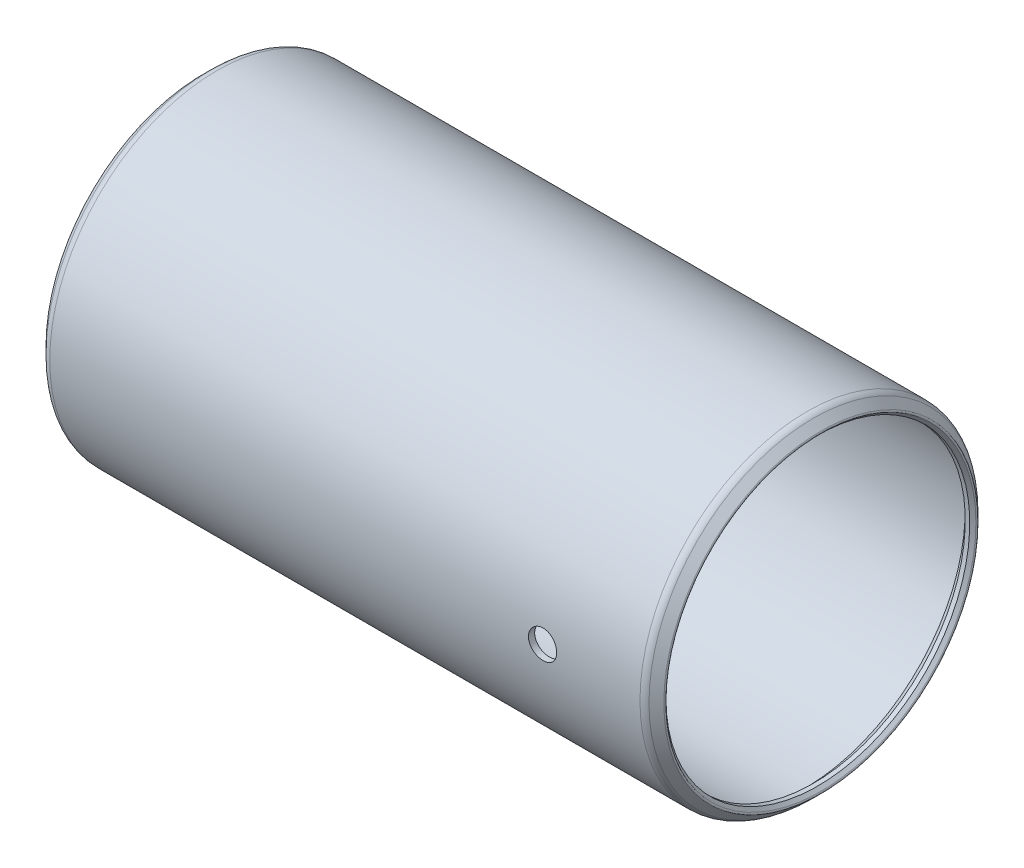
ISO-10303-21;
HEADER;
FILE_DESCRIPTION(('STEP AP214'),'2;1');
FILE_NAME('part.step','',(''),(''),'','','');
FILE_SCHEMA(('AUTOMOTIVE_DESIGN { 1 0 10303 214 1 1 1 1 }'));
ENDSEC;
DATA;
#1=APPLICATION_CONTEXT('core data for automotive mechanical design processes');
#2=APPLICATION_PROTOCOL_DEFINITION('international standard','automotive_design',2000,#1);
#3=PRODUCT_CONTEXT('',#1,'mechanical');
#4=PRODUCT('Part','Part','',(#3));
#5=PRODUCT_RELATED_PRODUCT_CATEGORY('part','',(#4));
#6=PRODUCT_DEFINITION_FORMATION('','',#4);
#7=PRODUCT_DEFINITION_CONTEXT('part definition',#1,'design');
#8=PRODUCT_DEFINITION('design','',#6,#7);
#9=PRODUCT_DEFINITION_SHAPE('','',#8);
#10=(LENGTH_UNIT() NAMED_UNIT(*) SI_UNIT(.MILLI.,.METRE.));
#11=(NAMED_UNIT(*) PLANE_ANGLE_UNIT() SI_UNIT($,.RADIAN.));
#12=(NAMED_UNIT(*) SI_UNIT($,.STERADIAN.) SOLID_ANGLE_UNIT());
#13=UNCERTAINTY_MEASURE_WITH_UNIT(LENGTH_MEASURE(1.E-05),#10,'distance_accuracy_value','');
#14=(GEOMETRIC_REPRESENTATION_CONTEXT(3) GLOBAL_UNCERTAINTY_ASSIGNED_CONTEXT((#13)) GLOBAL_UNIT_ASSIGNED_CONTEXT((#10,
#11,#12)) REPRESENTATION_CONTEXT('',''));
#15=CARTESIAN_POINT('',(0.,0.,0.));
#16=DIRECTION('',(0.,0.,1.));
#17=DIRECTION('',(1.,0.,0.));
#18=AXIS2_PLACEMENT_3D('',#15,#16,#17);
#19=CARTESIAN_POINT('',(-0.639512806053463,0.,0.));
#20=DIRECTION('',(-1.,0.,0.));
#21=DIRECTION('',(0.,0.,1.));
#22=AXIS2_PLACEMENT_3D('',#19,#20,#21);
#23=CONICAL_SURFACE('',#22,13.1045628060535,0.785398163397435);
#24=CARTESIAN_POINT('',(-0.639512806053469,0.,0.));
#25=DIRECTION('',(1.,0.,0.));
#26=DIRECTION('',(0.,0.,-1.));
#27=AXIS2_PLACEMENT_3D('',#24,#25,#26);
#28=CIRCLE('',#27,13.1045628060535);
#29=CARTESIAN_POINT('',(-0.639512806053469,0.,-13.1045628060535));
#30=VERTEX_POINT('',#29);
#31=EDGE_CURVE('E136',#30,#30,#28,.T.);
#32=ORIENTED_EDGE('',*,*,#31,.F.);
#33=EDGE_LOOP('',(#32));
#34=FACE_BOUND('',#33,.T.);
#35=CARTESIAN_POINT('',(-0.380999999999999,0.,0.));
#36=DIRECTION('',(-1.,0.,0.));
#37=DIRECTION('',(0.,0.,1.));
#38=AXIS2_PLACEMENT_3D('',#35,#36,#37);
#39=CIRCLE('',#38,12.84605);
#40=CARTESIAN_POINT('',(-0.380999999999999,0.,12.84605));
#41=VERTEX_POINT('',#40);
#42=EDGE_CURVE('E139',#41,#41,#39,.F.);
#43=ORIENTED_EDGE('',*,*,#42,.T.);
#44=EDGE_LOOP('',(#43));
#45=FACE_BOUND('',#44,.T.);
#46=ADVANCED_FACE('F15',(#34,#45),#23,.F.);
#47=CARTESIAN_POINT('',(51.6046128060534,0.,0.));
#48=DIRECTION('',(1.,0.,0.));
#49=DIRECTION('',(0.,1.,0.));
#50=AXIS2_PLACEMENT_3D('',#47,#48,#49);
#51=CONICAL_SURFACE('',#50,13.1045628060534,0.785398163397472);
#52=CARTESIAN_POINT('',(51.3461,0.,0.));
#53=DIRECTION('',(-1.,0.,0.));
#54=DIRECTION('',(0.,0.,1.));
#55=AXIS2_PLACEMENT_3D('',#52,#53,#54);
#56=CIRCLE('',#55,12.84605);
#57=CARTESIAN_POINT('',(51.3461,0.,12.84605));
#58=VERTEX_POINT('',#57);
#59=EDGE_CURVE('E144',#58,#58,#56,.T.);
#60=ORIENTED_EDGE('',*,*,#59,.T.);
#61=EDGE_LOOP('',(#60));
#62=FACE_BOUND('',#61,.T.);
#63=CARTESIAN_POINT('',(51.6046128060534,0.,0.));
#64=DIRECTION('',(1.,0.,0.));
#65=DIRECTION('',(0.,0.,-1.));
#66=AXIS2_PLACEMENT_3D('',#63,#64,#65);
#67=CIRCLE('',#66,13.1045628060534);
#68=CARTESIAN_POINT('',(51.6046128060534,0.,-13.1045628060534));
#69=VERTEX_POINT('',#68);
#70=EDGE_CURVE('E112',#69,#69,#67,.F.);
#71=ORIENTED_EDGE('',*,*,#70,.F.);
#72=EDGE_LOOP('',(#71));
#73=FACE_BOUND('',#72,.T.);
#74=ADVANCED_FACE('F149',(#62,#73),#51,.F.);
#75=CARTESIAN_POINT('',(50.9651,0.,0.));
#76=DIRECTION('',(-1.,0.,0.));
#77=DIRECTION('',(0.,0.,1.));
#78=AXIS2_PLACEMENT_3D('',#75,#76,#77);
#79=CYLINDRICAL_SURFACE('',#78,12.84605);
#80=CARTESIAN_POINT('',(50.9651,0.,0.));
#81=DIRECTION('',(-1.,0.,0.));
#82=DIRECTION('',(0.,0.,1.));
#83=AXIS2_PLACEMENT_3D('',#80,#81,#82);
#84=CIRCLE('',#83,12.84605);
#85=CARTESIAN_POINT('',(50.9651,0.,12.84605));
#86=VERTEX_POINT('',#85);
#87=EDGE_CURVE('E107',#86,#86,#84,.T.);
#88=ORIENTED_EDGE('',*,*,#87,.T.);
#89=EDGE_LOOP('',(#88));
#90=FACE_BOUND('',#89,.T.);
#91=ORIENTED_EDGE('',*,*,#59,.F.);
#92=EDGE_LOOP('',(#91));
#93=FACE_BOUND('',#92,.T.);
#94=ADVANCED_FACE('F152',(#90,#93),#79,.F.);
#95=CARTESIAN_POINT('',(50.9651,0.,0.));
#96=DIRECTION('',(-1.,0.,0.));
#97=DIRECTION('',(0.,0.,1.));
#98=AXIS2_PLACEMENT_3D('',#95,#96,#97);
#99=CYLINDRICAL_SURFACE('',#98,12.84605);
#100=ORIENTED_EDGE('',*,*,#42,.F.);
#101=EDGE_LOOP('',(#100));
#102=FACE_BOUND('',#101,.T.);
#103=CARTESIAN_POINT('',(0.,0.,0.));
#104=DIRECTION('',(1.,0.,0.));
#105=DIRECTION('',(0.,0.,-1.));
#106=AXIS2_PLACEMENT_3D('',#103,#104,#105);
#107=CIRCLE('',#106,12.84605);
#108=CARTESIAN_POINT('',(0.,0.,-12.84605));
#109=VERTEX_POINT('',#108);
#110=EDGE_CURVE('E102',#109,#109,#107,.T.);
#111=ORIENTED_EDGE('',*,*,#110,.T.);
#112=EDGE_LOOP('',(#111));
#113=FACE_BOUND('',#112,.T.);
#114=ADVANCED_FACE('F130',(#102,#113),#99,.F.);
#115=CARTESIAN_POINT('',(-0.549710244842765,0.,0.));
#116=DIRECTION('',(1.,0.,0.));
#117=DIRECTION('',(0.,0.,-1.));
#118=AXIS2_PLACEMENT_3D('',#115,#116,#117);
#119=TOROIDAL_SURFACE('',#118,13.1943653672641,0.127000000000003);
#120=CARTESIAN_POINT('',(-0.639512806053453,0.,0.));
#121=DIRECTION('',(1.,0.,0.));
#122=DIRECTION('',(0.,0.,-1.));
#123=AXIS2_PLACEMENT_3D('',#120,#121,#122);
#124=CIRCLE('',#123,13.2841679284748);
#125=CARTESIAN_POINT('',(-0.639512806053453,0.,-13.2841679284748));
#126=VERTEX_POINT('',#125);
#127=EDGE_CURVE('E97',#126,#126,#124,.T.);
#128=ORIENTED_EDGE('',*,*,#127,.F.);
#129=EDGE_LOOP('',(#128));
#130=FACE_BOUND('',#129,.T.);
#131=ORIENTED_EDGE('',*,*,#31,.T.);
#132=EDGE_LOOP('',(#131));
#133=FACE_BOUND('',#132,.T.);
#134=ADVANCED_FACE('F124',(#130,#133),#119,.T.);
#135=CARTESIAN_POINT('',(51.5148102448427,0.,0.));
#136=DIRECTION('',(1.,0.,0.));
#137=DIRECTION('',(0.,0.,-1.));
#138=AXIS2_PLACEMENT_3D('',#135,#136,#137);
#139=TOROIDAL_SURFACE('',#138,13.1943653672641,0.126999999999983);
#140=ORIENTED_EDGE('',*,*,#70,.T.);
#141=EDGE_LOOP('',(#140));
#142=FACE_BOUND('',#141,.T.);
#143=CARTESIAN_POINT('',(51.6046128060534,0.,0.));
#144=DIRECTION('',(-1.,0.,0.));
#145=DIRECTION('',(0.,0.,1.));
#146=AXIS2_PLACEMENT_3D('',#143,#144,#145);
#147=CIRCLE('',#146,13.2841679284748);
#148=CARTESIAN_POINT('',(51.6046128060534,0.,13.2841679284748));
#149=VERTEX_POINT('',#148);
#150=EDGE_CURVE('E92',#149,#149,#147,.T.);
#151=ORIENTED_EDGE('',*,*,#150,.F.);
#152=EDGE_LOOP('',(#151));
#153=FACE_BOUND('',#152,.T.);
#154=ADVANCED_FACE('F119',(#142,#153),#139,.T.);
#155=CARTESIAN_POINT('',(50.2031,0.,0.));
#156=DIRECTION('',(-1.,0.,0.));
#157=DIRECTION('',(0.,-1.,0.));
#158=AXIS2_PLACEMENT_3D('',#155,#156,#157);
#159=CONICAL_SURFACE('',#158,13.60805,0.785398163397445);
#160=CARTESIAN_POINT('',(50.2031,0.,0.));
#161=DIRECTION('',(-1.,0.,0.));
#162=DIRECTION('',(0.,0.,1.));
#163=AXIS2_PLACEMENT_3D('',#160,#161,#162);
#164=CIRCLE('',#163,13.60805);
#165=CARTESIAN_POINT('',(50.2031,0.,13.60805));
#166=VERTEX_POINT('',#165);
#167=EDGE_CURVE('E87',#166,#166,#164,.T.);
#168=ORIENTED_EDGE('',*,*,#167,.T.);
#169=EDGE_LOOP('',(#168));
#170=FACE_BOUND('',#169,.T.);
#171=ORIENTED_EDGE('',*,*,#87,.F.);
#172=EDGE_LOOP('',(#171));
#173=FACE_BOUND('',#172,.T.);
#174=ADVANCED_FACE('F123',(#170,#173),#159,.F.);
#175=CARTESIAN_POINT('',(0.761999999999998,0.,0.));
#176=DIRECTION('',(1.,0.,0.));
#177=DIRECTION('',(0.,1.,0.));
#178=AXIS2_PLACEMENT_3D('',#175,#176,#177);
#179=CONICAL_SURFACE('',#178,13.60805,0.78539816339745);
#180=ORIENTED_EDGE('',*,*,#110,.F.);
#181=EDGE_LOOP('',(#180));
#182=FACE_BOUND('',#181,.T.);
#183=CARTESIAN_POINT('',(0.761999999999999,0.,0.));
#184=DIRECTION('',(-1.,0.,0.));
#185=DIRECTION('',(0.,0.,1.));
#186=AXIS2_PLACEMENT_3D('',#183,#184,#185);
#187=CIRCLE('',#186,13.60805);
#188=CARTESIAN_POINT('',(0.761999999999999,0.,13.60805));
#189=VERTEX_POINT('',#188);
#190=EDGE_CURVE('E82',#189,#189,#187,.F.);
#191=ORIENTED_EDGE('',*,*,#190,.T.);
#192=EDGE_LOOP('',(#191));
#193=FACE_BOUND('',#192,.T.);
#194=ADVANCED_FACE('F163',(#182,#193),#179,.F.);
#195=CARTESIAN_POINT('',(-0.0117653672641466,0.,0.));
#196=DIRECTION('',(1.,0.,0.));
#197=DIRECTION('',(0.,0.,-1.));
#198=AXIS2_PLACEMENT_3D('',#195,#196,#197);
#199=CONICAL_SURFACE('',#198,13.9119153672641,0.785398163397447);
#200=CARTESIAN_POINT('',(-0.0117653672641455,0.,0.));
#201=DIRECTION('',(1.,0.,0.));
#202=DIRECTION('',(0.,0.,-1.));
#203=AXIS2_PLACEMENT_3D('',#200,#201,#202);
#204=CIRCLE('',#203,13.9119153672641);
#205=CARTESIAN_POINT('',(-0.0117653672641455,0.,-13.9119153672641));
#206=VERTEX_POINT('',#205);
#207=EDGE_CURVE('E79',#206,#206,#204,.T.);
#208=ORIENTED_EDGE('',*,*,#207,.F.);
#209=EDGE_LOOP('',(#208));
#210=FACE_BOUND('',#209,.T.);
#211=ORIENTED_EDGE('',*,*,#127,.T.);
#212=EDGE_LOOP('',(#211));
#213=FACE_BOUND('',#212,.T.);
#214=ADVANCED_FACE('F168',(#210,#213),#199,.T.);
#215=CARTESIAN_POINT('',(50.9768653672641,0.,0.));
#216=DIRECTION('',(-1.,0.,0.));
#217=DIRECTION('',(0.,-1.,0.));
#218=AXIS2_PLACEMENT_3D('',#215,#216,#217);
#219=CONICAL_SURFACE('',#218,13.911915367264,0.785398163397446);
#220=ORIENTED_EDGE('',*,*,#150,.T.);
#221=EDGE_LOOP('',(#220));
#222=FACE_BOUND('',#221,.T.);
#223=CARTESIAN_POINT('',(50.9768653672642,0.,0.));
#224=DIRECTION('',(1.,0.,0.));
#225=DIRECTION('',(0.,0.,-1.));
#226=AXIS2_PLACEMENT_3D('',#223,#224,#225);
#227=CIRCLE('',#226,13.9119153672641);
#228=CARTESIAN_POINT('',(50.9768653672642,0.,-13.9119153672641));
#229=VERTEX_POINT('',#228);
#230=EDGE_CURVE('E58',#229,#229,#227,.F.);
#231=ORIENTED_EDGE('',*,*,#230,.F.);
#232=EDGE_LOOP('',(#231));
#233=FACE_BOUND('',#232,.T.);
#234=ADVANCED_FACE('F173',(#222,#233),#219,.T.);
#235=CARTESIAN_POINT('',(50.9651,0.,0.));
#236=DIRECTION('',(-1.,0.,0.));
#237=DIRECTION('',(0.,0.,1.));
#238=AXIS2_PLACEMENT_3D('',#235,#236,#237);
#239=CYLINDRICAL_SURFACE('',#238,13.60805);
#240=CARTESIAN_POINT('',(41.0140933479615,-0.117481534847179,13.6075442397928));
#241=CARTESIAN_POINT('',(41.0206869855382,-0.18413176839559,13.6069684748813));
#242=CARTESIAN_POINT('',(41.0329082058254,-0.250267009692625,13.6059020730836));
#243=CARTESIAN_POINT('',(41.0682679309929,-0.379586036635725,13.6029087122964));
#244=CARTESIAN_POINT('',(41.0914189065873,-0.442766360022329,13.6009807704351));
#245=CARTESIAN_POINT('',(41.1479602788869,-0.564300968609075,13.5964807765784));
#246=CARTESIAN_POINT('',(41.1813446114105,-0.622658086057698,13.5939091062149));
#247=CARTESIAN_POINT('',(41.2573994208689,-0.732929092559678,13.5884101952969));
#248=CARTESIAN_POINT('',(41.3000678867631,-0.784844373164209,13.5854830318066));
#249=CARTESIAN_POINT('',(41.3936127778669,-0.88091593067277,13.5795927431799));
#250=CARTESIAN_POINT('',(41.4445094405091,-0.925052501431843,13.5766295464764));
#251=CARTESIAN_POINT('',(41.5530041814139,-1.00416163747058,13.5710081412247));
#252=CARTESIAN_POINT('',(41.6106025056256,-1.03913386626829,13.5683499438769));
#253=CARTESIAN_POINT('',(41.730895365159,-1.09892552133982,13.5636385801523));
#254=CARTESIAN_POINT('',(41.7935915605843,-1.12374162430725,13.5615856118809));
#255=CARTESIAN_POINT('',(41.9222827585668,-1.16248704253592,13.5583195815197));
#256=CARTESIAN_POINT('',(41.988277681367,-1.17641662087784,13.5571064991335));
#257=CARTESIAN_POINT('',(42.1214621166175,-1.19295608035039,13.5556611981208));
#258=CARTESIAN_POINT('',(42.1886470177073,-1.19560282362925,13.5554257854151));
#259=CARTESIAN_POINT('',(42.3225055744993,-1.18960050167086,13.5559538238053));
#260=CARTESIAN_POINT('',(42.3891792370668,-1.18095158838895,13.5567172614642));
#261=CARTESIAN_POINT('',(42.5200014797948,-1.15263540358785,13.5591539391863));
#262=CARTESIAN_POINT('',(42.5841543329104,-1.13298772172058,13.5608255615471));
#263=CARTESIAN_POINT('',(42.7082525039157,-1.08325287330124,13.5648887486911));
#264=CARTESIAN_POINT('',(42.7681977459939,-1.05316551870815,13.567280326442));
#265=CARTESIAN_POINT('',(42.8823439083078,-0.983318281533327,13.5725213110986));
#266=CARTESIAN_POINT('',(42.9365301196607,-0.943534447554801,13.5753718456688));
#267=CARTESIAN_POINT('',(43.037468768589,-0.855455605351628,13.5812062525142));
#268=CARTESIAN_POINT('',(43.0842210644357,-0.807160434894054,13.5841901273302));
#269=CARTESIAN_POINT('',(43.1691015768444,-0.703263099620976,13.5899652403713));
#270=CARTESIAN_POINT('',(43.2072046255716,-0.647640336528038,13.5927559004053));
#271=CARTESIAN_POINT('',(43.2735298522698,-0.530764654270234,13.5978207924369));
#272=CARTESIAN_POINT('',(43.3017521142231,-0.469511782964447,13.6000950288237));
#273=CARTESIAN_POINT('',(43.3474762075708,-0.343188408511368,13.6038682416845));
#274=CARTESIAN_POINT('',(43.3649910189166,-0.278122632828523,13.605368156474));
#275=CARTESIAN_POINT('',(43.3888446792824,-0.145959724455271,13.607427608838));
#276=CARTESIAN_POINT('',(43.3951837885262,-0.0788626391004902,13.6079871683085));
#277=CARTESIAN_POINT('',(43.3964991153963,0.0552153473335301,13.6081025593863));
#278=CARTESIAN_POINT('',(43.3915137695201,0.122195871515823,13.6076617862417));
#279=CARTESIAN_POINT('',(43.3704046707414,0.254364238494834,13.6058330590318));
#280=CARTESIAN_POINT('',(43.3542809357108,0.319552084167777,13.6044451064863));
#281=CARTESIAN_POINT('',(43.3113672628927,0.446271528242593,13.6008781484033));
#282=CARTESIAN_POINT('',(43.2845804153442,0.507804180011056,13.5986993720678));
#283=CARTESIAN_POINT('',(43.2211047830568,0.625506775072145,13.5937941783715));
#284=CARTESIAN_POINT('',(43.1844157815991,0.681676600957374,13.5910677490251));
#285=CARTESIAN_POINT('',(43.102035923157,0.787255775622204,13.5853620559642));
#286=CARTESIAN_POINT('',(43.0563161383224,0.836642511297565,13.5823819977438));
#287=CARTESIAN_POINT('',(42.9572373720124,0.927051067183488,13.5765112818918));
#288=CARTESIAN_POINT('',(42.9038782953176,0.968072783113276,13.573620625375));
#289=CARTESIAN_POINT('',(42.7909195711309,1.04065589952096,13.5682493969933));
#290=CARTESIAN_POINT('',(42.7313091116742,1.0722005325413,13.5657695554041));
#291=CARTESIAN_POINT('',(42.6076125927694,1.12482679893408,13.5615076784185));
#292=CARTESIAN_POINT('',(42.5435266170385,1.14590862795989,13.5597256299736));
#293=CARTESIAN_POINT('',(42.4128675554456,1.1769592942717,13.5570659172403));
#294=CARTESIAN_POINT('',(42.3463010792884,1.18695574852386,13.556186005875));
#295=CARTESIAN_POINT('',(42.2124293677137,1.19563823723098,13.5554230411251));
#296=CARTESIAN_POINT('',(42.1451241452898,1.19432447029993,13.5555399702354));
#297=CARTESIAN_POINT('',(42.0118893874062,1.18044554938091,13.5567555167168));
#298=CARTESIAN_POINT('',(41.9459564613716,1.16791266060187,13.557851318916));
#299=CARTESIAN_POINT('',(41.8171338903118,1.1320030289046,13.5608965695299));
#300=CARTESIAN_POINT('',(41.7542442766507,1.10862617425581,13.5628460267402));
#301=CARTESIAN_POINT('',(41.6332015351946,1.05166192882191,13.5673816632809));
#302=CARTESIAN_POINT('',(41.5750545022093,1.01806165389656,13.5699686452702));
#303=CARTESIAN_POINT('',(41.465215850551,0.941614257416068,13.5754871353723));
#304=CARTESIAN_POINT('',(41.4135241508629,0.89876725192684,13.5784186391605));
#305=CARTESIAN_POINT('',(41.3178806572403,0.804872984688232,13.5843078282703));
#306=CARTESIAN_POINT('',(41.2739550757582,0.75379902305626,13.5872655681575));
#307=CARTESIAN_POINT('',(41.1952863450887,0.644975103409609,13.5928655969191));
#308=CARTESIAN_POINT('',(41.1605453296908,0.587223598517057,13.5955078124118));
#309=CARTESIAN_POINT('',(41.1012286913691,0.466647688507194,13.6001803480205));
#310=CARTESIAN_POINT('',(41.0766603479259,0.40381968898307,13.6022102296746));
#311=CARTESIAN_POINT('',(41.0384573500719,0.274955672691629,13.6054240528221));
#312=CARTESIAN_POINT('',(41.0248101293918,0.208923435945655,13.6066089663972));
#313=CARTESIAN_POINT('',(41.0116339161283,0.0991759060706928,13.6077571118156));
#314=CARTESIAN_POINT('',(41.0088180747996,0.0558309892922241,13.6080042625973));
#315=CARTESIAN_POINT('',(41.0079120028784,-0.0309085094611926,13.6080843263223));
#316=CARTESIAN_POINT('',(41.0098217498984,-0.0743030911998775,13.6079172412281));
#317=CARTESIAN_POINT('',(41.0140933479615,-0.117481534847179,13.6075442397928));
#318=B_SPLINE_CURVE_WITH_KNOTS('',3,(#240,#241,#242,#243,#244,#245,#246,#247,#248,#249,#250,
#251,#252,#253,#254,#255,#256,#257,#258,#259,#260,#261,#262,#263,#264,#265,#266,#267,#268,#269,
#270,#271,#272,#273,#274,#275,#276,#277,#278,#279,#280,#281,#282,#283,#284,#285,#286,#287,#288,
#289,#290,#291,#292,#293,#294,#295,#296,#297,#298,#299,#300,#301,#302,#303,#304,#305,#306,#307,
#308,#309,#310,#311,#312,#313,#314,#315,#316,#317),.UNSPECIFIED.,.T.,.F.,(4,2,2,2,2,2,2,2,2,2,2,
2,2,2,2,2,2,2,2,2,2,2,2,2,2,2,2,2,2,2,2,2,2,2,2,2,2,2,4),(0.,0.200775758763099,
0.401781155855856,0.602667668750664,0.803510710763399,1.00485546375863,1.20620760837979,
1.40762558724545,1.60903869855024,1.80979326636441,2.01054513354631,2.21094057865125,
2.41133963349778,2.61223880465866,2.81314180553381,3.0146221126849,3.21610070729872,
3.41733457558211,3.6185637581151,3.81911096669241,4.01965785348704,4.22014666275858,
4.42063986029008,4.62178601853366,4.8229346841706,5.02443716692136,5.2259358814545,
5.42693146703869,5.62792352303191,5.82833939400616,6.02875733000657,6.22942889775887,
6.43009794680729,6.63143188138923,6.83281254952665,7.03433707599824,7.23562938573685,
7.36569983552598,7.49576966910278),.UNSPECIFIED.);
#319=CARTESIAN_POINT('',(41.0140933479615,-0.117481534847179,13.6075442397928));
#320=VERTEX_POINT('',#319);
#321=EDGE_CURVE('E18',#320,#320,#318,.T.);
#322=ORIENTED_EDGE('',*,*,#321,.T.);
#323=EDGE_LOOP('',(#322));
#324=FACE_BOUND('',#323,.T.);
#325=ORIENTED_EDGE('',*,*,#190,.F.);
#326=EDGE_LOOP('',(#325));
#327=FACE_BOUND('',#326,.T.);
#328=ORIENTED_EDGE('',*,*,#167,.F.);
#329=EDGE_LOOP('',(#328));
#330=FACE_BOUND('',#329,.T.);
#331=ADVANCED_FACE('F73',(#324,#327,#330),#239,.F.);
#332=CARTESIAN_POINT('',(0.527049999999987,0.,0.));
#333=DIRECTION('',(1.,0.,0.));
#334=DIRECTION('',(0.,0.,-1.));
#335=AXIS2_PLACEMENT_3D('',#332,#333,#334);
#336=TOROIDAL_SURFACE('',#335,13.3731,0.761999999999964);
#337=CARTESIAN_POINT('',(0.527050000000001,0.,0.));
#338=DIRECTION('',(-1.,0.,0.));
#339=DIRECTION('',(0.,0.,1.));
#340=AXIS2_PLACEMENT_3D('',#337,#338,#339);
#341=CIRCLE('',#340,14.1351);
#342=CARTESIAN_POINT('',(0.527050000000001,0.,14.1351));
#343=VERTEX_POINT('',#342);
#344=EDGE_CURVE('E30',#343,#343,#341,.F.);
#345=ORIENTED_EDGE('',*,*,#344,.F.);
#346=EDGE_LOOP('',(#345));
#347=FACE_BOUND('',#346,.T.);
#348=ORIENTED_EDGE('',*,*,#207,.T.);
#349=EDGE_LOOP('',(#348));
#350=FACE_BOUND('',#349,.T.);
#351=ADVANCED_FACE('F69',(#347,#350),#336,.T.);
#352=CARTESIAN_POINT('',(50.43805,0.,0.));
#353=DIRECTION('',(1.,0.,0.));
#354=DIRECTION('',(0.,0.,-1.));
#355=AXIS2_PLACEMENT_3D('',#352,#353,#354);
#356=TOROIDAL_SURFACE('',#355,13.3731,0.761999999999952);
#357=ORIENTED_EDGE('',*,*,#230,.T.);
#358=EDGE_LOOP('',(#357));
#359=FACE_BOUND('',#358,.T.);
#360=CARTESIAN_POINT('',(50.43805,0.,0.));
#361=DIRECTION('',(-1.,0.,0.));
#362=DIRECTION('',(0.,0.,1.));
#363=AXIS2_PLACEMENT_3D('',#360,#361,#362);
#364=CIRCLE('',#363,14.1351);
#365=CARTESIAN_POINT('',(50.43805,0.,14.1351));
#366=VERTEX_POINT('',#365);
#367=EDGE_CURVE('E26',#366,#366,#364,.T.);
#368=ORIENTED_EDGE('',*,*,#367,.F.);
#369=EDGE_LOOP('',(#368));
#370=FACE_BOUND('',#369,.T.);
#371=ADVANCED_FACE('F48',(#359,#370),#356,.T.);
#372=CARTESIAN_POINT('',(42.2021,0.,14.1351));
#373=DIRECTION('',(0.,0.,1.));
#374=DIRECTION('',(1.,0.,0.));
#375=AXIS2_PLACEMENT_3D('',#372,#373,#374);
#376=CYLINDRICAL_SURFACE('',#375,1.1938);
#377=CARTESIAN_POINT('',(41.0141273811434,0.117812859285372,14.1346091759292));
#378=CARTESIAN_POINT('',(41.0207404978546,0.184467309511488,14.1340530158088));
#379=CARTESIAN_POINT('',(41.0329807621086,0.250605764680496,14.1330257891213));
#380=CARTESIAN_POINT('',(41.0683818385719,0.379928682353318,14.1301416621876));
#381=CARTESIAN_POINT('',(41.0915551625269,0.443109669050478,14.1282838115068));
#382=CARTESIAN_POINT('',(41.1481430673334,0.564643202786372,14.1239487053835));
#383=CARTESIAN_POINT('',(41.1815516722875,0.622998542112265,14.1214718115261));
#384=CARTESIAN_POINT('',(41.2576566194204,0.733261516357451,14.1161762260072));
#385=CARTESIAN_POINT('',(41.3003509351073,0.785170554225565,14.1133576089819));
#386=CARTESIAN_POINT('',(41.3939393284296,0.881215498263703,14.1076871200842));
#387=CARTESIAN_POINT('',(41.4448522198732,0.925333071182961,14.1048351861806));
#388=CARTESIAN_POINT('',(41.5533751598776,1.00440130201931,14.0994257205578));
#389=CARTESIAN_POINT('',(41.610985452984,1.03935162505607,14.0968681995953));
#390=CARTESIAN_POINT('',(41.7312949314785,1.09909652499211,14.0923362509074));
#391=CARTESIAN_POINT('',(41.7939956207231,1.12388808750993,14.0903619963014));
#392=CARTESIAN_POINT('',(41.9226899502156,1.16258466978293,14.0872221864536));
#393=CARTESIAN_POINT('',(41.9886835166351,1.17648993349903,14.0860566130893));
#394=CARTESIAN_POINT('',(42.1218762618582,1.19298452753048,14.084669306056));
#395=CARTESIAN_POINT('',(42.189071179885,1.19560803068859,14.0844447221506));
#396=CARTESIAN_POINT('',(42.322945846252,1.18955637640729,14.0849570961222));
#397=CARTESIAN_POINT('',(42.389625601082,1.1808813615377,14.0856940418662));
#398=CARTESIAN_POINT('',(42.5204651386353,1.1525085182345,14.0880437243156));
#399=CARTESIAN_POINT('',(42.5846288767303,1.13282879995726,14.0896550219939));
#400=CARTESIAN_POINT('',(42.7087431951978,1.08302471201262,14.0935705077283));
#401=CARTESIAN_POINT('',(42.7686937046973,1.05290016669791,14.0958747074365));
#402=CARTESIAN_POINT('',(42.8828327341081,0.982980610529902,14.1009229384886));
#403=CARTESIAN_POINT('',(42.9370075901925,0.943163368418261,14.1036679759451));
#404=CARTESIAN_POINT('',(43.0379170244273,0.85501847584355,14.1092856109836));
#405=CARTESIAN_POINT('',(43.0846514714994,0.806690675480794,14.1121582108117));
#406=CARTESIAN_POINT('',(43.1694800385653,0.702742065324313,14.1177164051281));
#407=CARTESIAN_POINT('',(43.207550847117,0.647102200054323,14.1204014819136));
#408=CARTESIAN_POINT('',(43.2738092844399,0.530199608265126,14.1252737356095));
#409=CARTESIAN_POINT('',(43.3019969913305,0.46893692619545,14.1274609164555));
#410=CARTESIAN_POINT('',(43.3476533555885,0.342596502252566,14.1310886136871));
#411=CARTESIAN_POINT('',(43.3651341033654,0.277523154772049,14.1325299719768));
#412=CARTESIAN_POINT('',(43.388919157008,0.145352021516503,14.134507096411));
#413=CARTESIAN_POINT('',(43.3952237040193,0.0782542794530198,14.1350428820948));
#414=CARTESIAN_POINT('',(43.3964710537106,-0.0558358593672133,14.1351482297053));
#415=CARTESIAN_POINT('',(43.3914494826933,-0.122827924999944,14.1347208213622));
#416=CARTESIAN_POINT('',(43.370263958203,-0.255013491461167,14.132954072484));
#417=CARTESIAN_POINT('',(43.3541000207934,-0.320206994882409,14.1316147332635));
#418=CARTESIAN_POINT('',(43.3111019215347,-0.446933133794223,14.1281747928718));
#419=CARTESIAN_POINT('',(43.2842705546856,-0.508466723376842,14.1260743911212));
#420=CARTESIAN_POINT('',(43.2207028131235,-0.626163179769109,14.1213471376569));
#421=CARTESIAN_POINT('',(43.183966237109,-0.682325937397035,14.1187202752444));
#422=CARTESIAN_POINT('',(43.1014995234676,-0.78786892675694,14.113225020068));
#423=CARTESIAN_POINT('',(43.0557425444206,-0.837228150111191,14.1103559214312));
#424=CARTESIAN_POINT('',(42.9565941995641,-0.92757494730447,14.1047052706129));
#425=CARTESIAN_POINT('',(42.9032027459041,-0.968562424796016,14.1019237194394));
#426=CARTESIAN_POINT('',(42.790193898507,-1.04106584515117,14.0967571411297));
#427=CARTESIAN_POINT('',(42.7305665434108,-1.07256631203487,14.094372764698));
#428=CARTESIAN_POINT('',(42.6068457929559,-1.1251025654942,14.090276595382));
#429=CARTESIAN_POINT('',(42.5427524754232,-1.14613853437711,14.0885647907807));
#430=CARTESIAN_POINT('',(42.4120765603225,-1.17710089568322,14.0860118090634));
#431=CARTESIAN_POINT('',(42.3455000836903,-1.18705295238106,14.0851686210483));
#432=CARTESIAN_POINT('',(42.2116163983327,-1.19564516310287,14.0844419147526));
#433=CARTESIAN_POINT('',(42.1443092014018,-1.19428549944117,14.084558381005));
#434=CARTESIAN_POINT('',(42.0110632458659,-1.18031312765098,14.0857360691371));
#435=CARTESIAN_POINT('',(41.945121332311,-1.16773026358574,14.0867947854255));
#436=CARTESIAN_POINT('',(41.8162890240642,-1.13171645987864,14.089733616985));
#437=CARTESIAN_POINT('',(41.7533986592598,-1.10828541401107,14.0916137402993));
#438=CARTESIAN_POINT('',(41.6323688068092,-1.0512119673996,14.0959859994958));
#439=CARTESIAN_POINT('',(41.574235023808,-1.01755752699492,14.0984788563042));
#440=CARTESIAN_POINT('',(41.4644327252884,-0.941002002797534,14.1037950345459));
#441=CARTESIAN_POINT('',(41.4127641151458,-0.898101054361595,14.1066183511415));
#442=CARTESIAN_POINT('',(41.3171897621151,-0.804113304398698,14.1122879761113));
#443=CARTESIAN_POINT('',(41.2733082646206,-0.753001848792165,14.1151343284092));
#444=CARTESIAN_POINT('',(41.1947337609539,-0.644111624757788,14.1205218881482));
#445=CARTESIAN_POINT('',(41.1600429038268,-0.586331301476854,14.123063024145));
#446=CARTESIAN_POINT('',(41.1008318401374,-0.465709862867591,14.1275549766702));
#447=CARTESIAN_POINT('',(41.0763186401911,-0.402865296580183,14.1295053862751));
#448=CARTESIAN_POINT('',(41.0382275147842,-0.273979624508697,14.1325909447995));
#449=CARTESIAN_POINT('',(41.0246369726802,-0.207942300432136,14.1337270341669));
#450=CARTESIAN_POINT('',(41.0115650739564,-0.0982990462207916,14.1348239271863));
#451=CARTESIAN_POINT('',(41.0087860119568,-0.0550616263885722,14.1350589215159));
#452=CARTESIAN_POINT('',(41.0079306433203,0.0314599597068804,14.1351312264354));
#453=CARTESIAN_POINT('',(41.0098543197023,0.0747441258007518,14.1349685384612));
#454=CARTESIAN_POINT('',(41.0141273811434,0.117812859285372,14.1346091759292));
#455=B_SPLINE_CURVE_WITH_KNOTS('',3,(#377,#378,#379,#380,#381,#382,#383,#384,#385,#386,#387,
#388,#389,#390,#391,#392,#393,#394,#395,#396,#397,#398,#399,#400,#401,#402,#403,#404,#405,#406,
#407,#408,#409,#410,#411,#412,#413,#414,#415,#416,#417,#418,#419,#420,#421,#422,#423,#424,#425,
#426,#427,#428,#429,#430,#431,#432,#433,#434,#435,#436,#437,#438,#439,#440,#441,#442,#443,#444,
#445,#446,#447,#448,#449,#450,#451,#452,#453,#454),.UNSPECIFIED.,.T.,.F.,(4,2,2,2,2,2,2,2,2,2,2,
2,2,2,2,2,2,2,2,2,2,2,2,2,2,2,2,2,2,2,2,2,2,2,2,2,2,2,4),(0.,0.200793885605463,0.40181811830846,
0.602725205405803,0.803588490924823,1.00491828530234,1.20625543324863,1.40765228023488,
1.60904461380798,1.80982649143269,2.01060583552525,2.21105573053676,2.41150899661371,
2.61242642925042,2.81334740107595,3.01480276612653,3.21625653876788,3.41748240629143,
3.61870393197002,3.8192933983777,4.01988257560676,4.22041923056182,4.42095996128857,
4.62210668890636,4.82325573132075,5.02473114884628,5.22620305624444,5.4272074887844,
5.62820868168271,5.82867697245556,6.02914722626147,6.22985448674363,6.43055880933395,
6.63187746640479,6.83324315629923,7.03474724366199,7.23601823996635,7.3657615585647,
7.49550440866917),.UNSPECIFIED.);
#456=CARTESIAN_POINT('',(41.0141273811434,0.117812859285372,14.1346091759292));
#457=VERTEX_POINT('',#456);
#458=EDGE_CURVE('E10',#457,#457,#455,.T.);
#459=ORIENTED_EDGE('',*,*,#458,.F.);
#460=EDGE_LOOP('',(#459));
#461=FACE_BOUND('',#460,.T.);
#462=ORIENTED_EDGE('',*,*,#321,.F.);
#463=EDGE_LOOP('',(#462));
#464=FACE_BOUND('',#463,.T.);
#465=ADVANCED_FACE('F38',(#461,#464),#376,.F.);
#466=CARTESIAN_POINT('',(50.9651,0.,0.));
#467=DIRECTION('',(-1.,0.,0.));
#468=DIRECTION('',(0.,0.,1.));
#469=AXIS2_PLACEMENT_3D('',#466,#467,#468);
#470=CYLINDRICAL_SURFACE('',#469,14.1351);
#471=ORIENTED_EDGE('',*,*,#458,.T.);
#472=EDGE_LOOP('',(#471));
#473=FACE_BOUND('',#472,.T.);
#474=ORIENTED_EDGE('',*,*,#367,.T.);
#475=EDGE_LOOP('',(#474));
#476=FACE_BOUND('',#475,.T.);
#477=ORIENTED_EDGE('',*,*,#344,.T.);
#478=EDGE_LOOP('',(#477));
#479=FACE_BOUND('',#478,.T.);
#480=ADVANCED_FACE('F41',(#473,#476,#479),#470,.T.);
#481=CLOSED_SHELL('',(#46,#74,#94,#114,#134,#154,#174,#194,#214,#234,#331,#351,#371,#465,#480));
#482=MANIFOLD_SOLID_BREP('B1',#481);
#483=ADVANCED_BREP_SHAPE_REPRESENTATION('',(#18,#482),#14);
#484=SHAPE_DEFINITION_REPRESENTATION(#9,#483);
ENDSEC;
END-ISO-10303-21;
